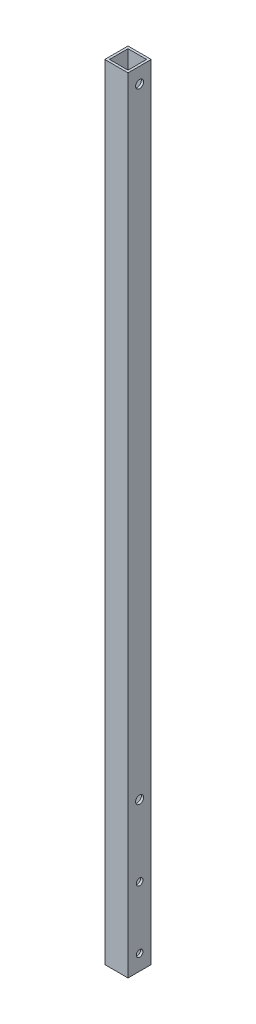
ISO-10303-21;
HEADER;
FILE_DESCRIPTION(('STEP AP214'),'2;1');
FILE_NAME('part.step','',(''),(''),'','','');
FILE_SCHEMA(('AUTOMOTIVE_DESIGN { 1 0 10303 214 1 1 1 1 }'));
ENDSEC;
DATA;
#1=APPLICATION_CONTEXT('core data for automotive mechanical design processes');
#2=APPLICATION_PROTOCOL_DEFINITION('international standard','automotive_design',2000,#1);
#3=PRODUCT_CONTEXT('',#1,'mechanical');
#4=PRODUCT('Part','Part','',(#3));
#5=PRODUCT_RELATED_PRODUCT_CATEGORY('part','',(#4));
#6=PRODUCT_DEFINITION_FORMATION('','',#4);
#7=PRODUCT_DEFINITION_CONTEXT('part definition',#1,'design');
#8=PRODUCT_DEFINITION('design','',#6,#7);
#9=PRODUCT_DEFINITION_SHAPE('','',#8);
#10=(LENGTH_UNIT() NAMED_UNIT(*) SI_UNIT(.MILLI.,.METRE.));
#11=(NAMED_UNIT(*) PLANE_ANGLE_UNIT() SI_UNIT($,.RADIAN.));
#12=(NAMED_UNIT(*) SI_UNIT($,.STERADIAN.) SOLID_ANGLE_UNIT());
#13=UNCERTAINTY_MEASURE_WITH_UNIT(LENGTH_MEASURE(1.E-05),#10,'distance_accuracy_value','');
#14=(GEOMETRIC_REPRESENTATION_CONTEXT(3) GLOBAL_UNCERTAINTY_ASSIGNED_CONTEXT((#13)) GLOBAL_UNIT_ASSIGNED_CONTEXT((#10,
#11,#12)) REPRESENTATION_CONTEXT('',''));
#15=CARTESIAN_POINT('',(0.,0.,0.));
#16=DIRECTION('',(0.,0.,1.));
#17=DIRECTION('',(1.,0.,0.));
#18=AXIS2_PLACEMENT_3D('',#15,#16,#17);
#19=CARTESIAN_POINT('',(0.,506.,0.));
#20=DIRECTION('',(0.,1.,0.));
#21=DIRECTION('',(0.,0.,1.));
#22=AXIS2_PLACEMENT_3D('',#19,#20,#21);
#23=PLANE('',#22);
#24=DIRECTION('',(0.,0.,1.));
#25=VECTOR('',#24,1.);
#26=CARTESIAN_POINT('',(0.,506.,0.));
#27=LINE('',#26,#25);
#28=CARTESIAN_POINT('',(0.,506.,-15.));
#29=VERTEX_POINT('',#28);
#30=CARTESIAN_POINT('',(0.,506.,0.));
#31=VERTEX_POINT('',#30);
#32=EDGE_CURVE('E164',#29,#31,#27,.T.);
#33=ORIENTED_EDGE('',*,*,#32,.T.);
#34=DIRECTION('',(1.,0.,0.));
#35=VECTOR('',#34,1.);
#36=CARTESIAN_POINT('',(0.,506.,0.));
#37=LINE('',#36,#35);
#38=CARTESIAN_POINT('',(15.,506.,0.));
#39=VERTEX_POINT('',#38);
#40=EDGE_CURVE('E167',#31,#39,#37,.T.);
#41=ORIENTED_EDGE('',*,*,#40,.T.);
#42=DIRECTION('',(0.,0.,-1.));
#43=VECTOR('',#42,1.);
#44=CARTESIAN_POINT('',(15.,506.,0.));
#45=LINE('',#44,#43);
#46=CARTESIAN_POINT('',(15.,506.,-15.));
#47=VERTEX_POINT('',#46);
#48=EDGE_CURVE('E170',#39,#47,#45,.T.);
#49=ORIENTED_EDGE('',*,*,#48,.T.);
#50=DIRECTION('',(-1.,0.,0.));
#51=VECTOR('',#50,1.);
#52=CARTESIAN_POINT('',(0.,506.,-15.));
#53=LINE('',#52,#51);
#54=EDGE_CURVE('E172',#47,#29,#53,.T.);
#55=ORIENTED_EDGE('',*,*,#54,.T.);
#56=EDGE_LOOP('',(#33,#41,#49,#55));
#57=FACE_BOUND('',#56,.T.);
#58=DIRECTION('',(1.,0.,0.));
#59=VECTOR('',#58,1.);
#60=CARTESIAN_POINT('',(0.,506.,-1.5));
#61=LINE('',#60,#59);
#62=CARTESIAN_POINT('',(1.5,506.,-1.5));
#63=VERTEX_POINT('',#62);
#64=CARTESIAN_POINT('',(13.5,506.,-1.5));
#65=VERTEX_POINT('',#64);
#66=EDGE_CURVE('E134',#63,#65,#61,.T.);
#67=ORIENTED_EDGE('',*,*,#66,.F.);
#68=DIRECTION('',(0.,0.,1.));
#69=VECTOR('',#68,1.);
#70=CARTESIAN_POINT('',(1.5,506.,0.));
#71=LINE('',#70,#69);
#72=CARTESIAN_POINT('',(1.5,506.,-13.5));
#73=VERTEX_POINT('',#72);
#74=EDGE_CURVE('E126',#73,#63,#71,.T.);
#75=ORIENTED_EDGE('',*,*,#74,.F.);
#76=DIRECTION('',(-1.,0.,0.));
#77=VECTOR('',#76,1.);
#78=CARTESIAN_POINT('',(0.,506.,-13.5));
#79=LINE('',#78,#77);
#80=CARTESIAN_POINT('',(13.5,506.,-13.5));
#81=VERTEX_POINT('',#80);
#82=EDGE_CURVE('E148',#81,#73,#79,.T.);
#83=ORIENTED_EDGE('',*,*,#82,.F.);
#84=DIRECTION('',(0.,0.,-1.));
#85=VECTOR('',#84,1.);
#86=CARTESIAN_POINT('',(13.5,506.,0.));
#87=LINE('',#86,#85);
#88=EDGE_CURVE('E146',#65,#81,#87,.T.);
#89=ORIENTED_EDGE('',*,*,#88,.F.);
#90=EDGE_LOOP('',(#67,#75,#83,#89));
#91=FACE_BOUND('',#90,.T.);
#92=ADVANCED_FACE('F59',(#57,#91),#23,.T.);
#93=CARTESIAN_POINT('',(0.,0.,0.));
#94=DIRECTION('',(0.,1.,0.));
#95=DIRECTION('',(0.,0.,1.));
#96=AXIS2_PLACEMENT_3D('',#93,#94,#95);
#97=PLANE('',#96);
#98=DIRECTION('',(0.,0.,1.));
#99=VECTOR('',#98,1.);
#100=CARTESIAN_POINT('',(0.,0.,0.));
#101=LINE('',#100,#99);
#102=CARTESIAN_POINT('',(0.,0.,-15.));
#103=VERTEX_POINT('',#102);
#104=CARTESIAN_POINT('',(0.,0.,0.));
#105=VERTEX_POINT('',#104);
#106=EDGE_CURVE('E142',#103,#105,#101,.T.);
#107=ORIENTED_EDGE('',*,*,#106,.F.);
#108=DIRECTION('',(-1.,0.,0.));
#109=VECTOR('',#108,1.);
#110=CARTESIAN_POINT('',(0.,0.,-15.));
#111=LINE('',#110,#109);
#112=CARTESIAN_POINT('',(15.,0.,-15.));
#113=VERTEX_POINT('',#112);
#114=EDGE_CURVE('E168',#113,#103,#111,.T.);
#115=ORIENTED_EDGE('',*,*,#114,.F.);
#116=DIRECTION('',(0.,0.,-1.));
#117=VECTOR('',#116,1.);
#118=CARTESIAN_POINT('',(15.,0.,0.));
#119=LINE('',#118,#117);
#120=CARTESIAN_POINT('',(15.,0.,0.));
#121=VERTEX_POINT('',#120);
#122=EDGE_CURVE('E179',#121,#113,#119,.T.);
#123=ORIENTED_EDGE('',*,*,#122,.F.);
#124=DIRECTION('',(1.,0.,0.));
#125=VECTOR('',#124,1.);
#126=CARTESIAN_POINT('',(0.,0.,0.));
#127=LINE('',#126,#125);
#128=EDGE_CURVE('E177',#105,#121,#127,.T.);
#129=ORIENTED_EDGE('',*,*,#128,.F.);
#130=EDGE_LOOP('',(#107,#115,#123,#129));
#131=FACE_BOUND('',#130,.T.);
#132=DIRECTION('',(0.,0.,1.));
#133=VECTOR('',#132,1.);
#134=CARTESIAN_POINT('',(1.5,0.,0.));
#135=LINE('',#134,#133);
#136=CARTESIAN_POINT('',(1.5,0.,-13.5));
#137=VERTEX_POINT('',#136);
#138=CARTESIAN_POINT('',(1.5,0.,-1.5));
#139=VERTEX_POINT('',#138);
#140=EDGE_CURVE('E84',#137,#139,#135,.T.);
#141=ORIENTED_EDGE('',*,*,#140,.T.);
#142=DIRECTION('',(1.,0.,0.));
#143=VECTOR('',#142,1.);
#144=CARTESIAN_POINT('',(0.,0.,-1.5));
#145=LINE('',#144,#143);
#146=CARTESIAN_POINT('',(13.5,0.,-1.5));
#147=VERTEX_POINT('',#146);
#148=EDGE_CURVE('E141',#139,#147,#145,.T.);
#149=ORIENTED_EDGE('',*,*,#148,.T.);
#150=DIRECTION('',(0.,0.,-1.));
#151=VECTOR('',#150,1.);
#152=CARTESIAN_POINT('',(13.5,0.,0.));
#153=LINE('',#152,#151);
#154=CARTESIAN_POINT('',(13.5,0.,-13.5));
#155=VERTEX_POINT('',#154);
#156=EDGE_CURVE('E156',#147,#155,#153,.T.);
#157=ORIENTED_EDGE('',*,*,#156,.T.);
#158=DIRECTION('',(-1.,0.,0.));
#159=VECTOR('',#158,1.);
#160=CARTESIAN_POINT('',(0.,0.,-13.5));
#161=LINE('',#160,#159);
#162=EDGE_CURVE('E135',#155,#137,#161,.T.);
#163=ORIENTED_EDGE('',*,*,#162,.T.);
#164=EDGE_LOOP('',(#141,#149,#157,#163));
#165=FACE_BOUND('',#164,.T.);
#166=ADVANCED_FACE('F231',(#131,#165),#97,.F.);
#167=CARTESIAN_POINT('',(0.,506.,0.));
#168=DIRECTION('',(1.,0.,0.));
#169=DIRECTION('',(0.,0.,-1.));
#170=AXIS2_PLACEMENT_3D('',#167,#168,#169);
#171=PLANE('',#170);
#172=CARTESIAN_POINT('',(0.,496.,-7.5));
#173=DIRECTION('',(1.,0.,0.));
#174=DIRECTION('',(0.,0.,-1.));
#175=AXIS2_PLACEMENT_3D('',#172,#173,#174);
#176=CIRCLE('',#175,2.60000000000003);
#177=CARTESIAN_POINT('',(0.,496.,-10.1));
#178=VERTEX_POINT('',#177);
#179=EDGE_CURVE('E284',#178,#178,#176,.F.);
#180=ORIENTED_EDGE('',*,*,#179,.F.);
#181=EDGE_LOOP('',(#180));
#182=FACE_BOUND('',#181,.T.);
#183=CARTESIAN_POINT('',(0.,10.,-7.50000000000011));
#184=DIRECTION('',(1.,0.,0.));
#185=DIRECTION('',(0.,0.,-1.));
#186=AXIS2_PLACEMENT_3D('',#183,#184,#185);
#187=CIRCLE('',#186,2.15);
#188=CARTESIAN_POINT('',(0.,10.,-9.65000000000012));
#189=VERTEX_POINT('',#188);
#190=EDGE_CURVE('E288',#189,#189,#187,.F.);
#191=ORIENTED_EDGE('',*,*,#190,.F.);
#192=EDGE_LOOP('',(#191));
#193=FACE_BOUND('',#192,.T.);
#194=CARTESIAN_POINT('',(0.,50.,-7.50000000000011));
#195=DIRECTION('',(1.,0.,0.));
#196=DIRECTION('',(0.,0.,-1.));
#197=AXIS2_PLACEMENT_3D('',#194,#195,#196);
#198=CIRCLE('',#197,2.15);
#199=CARTESIAN_POINT('',(0.,50.,-9.65000000000011));
#200=VERTEX_POINT('',#199);
#201=EDGE_CURVE('E292',#200,#200,#198,.F.);
#202=ORIENTED_EDGE('',*,*,#201,.F.);
#203=EDGE_LOOP('',(#202));
#204=FACE_BOUND('',#203,.T.);
#205=CARTESIAN_POINT('',(0.,96.0000000000001,-7.5));
#206=DIRECTION('',(1.,0.,0.));
#207=DIRECTION('',(0.,0.,-1.));
#208=AXIS2_PLACEMENT_3D('',#205,#206,#207);
#209=CIRCLE('',#208,2.6);
#210=CARTESIAN_POINT('',(0.,96.0000000000001,-10.1));
#211=VERTEX_POINT('',#210);
#212=EDGE_CURVE('E193',#211,#211,#209,.F.);
#213=ORIENTED_EDGE('',*,*,#212,.F.);
#214=EDGE_LOOP('',(#213));
#215=FACE_BOUND('',#214,.T.);
#216=ORIENTED_EDGE('',*,*,#106,.T.);
#217=DIRECTION('',(0.,-1.,0.));
#218=VECTOR('',#217,1.);
#219=CARTESIAN_POINT('',(0.,506.,0.));
#220=LINE('',#219,#218);
#221=EDGE_CURVE('E12',#31,#105,#220,.T.);
#222=ORIENTED_EDGE('',*,*,#221,.F.);
#223=ORIENTED_EDGE('',*,*,#32,.F.);
#224=DIRECTION('',(0.,-1.,0.));
#225=VECTOR('',#224,1.);
#226=CARTESIAN_POINT('',(0.,506.,-15.));
#227=LINE('',#226,#225);
#228=EDGE_CURVE('E174',#29,#103,#227,.T.);
#229=ORIENTED_EDGE('',*,*,#228,.T.);
#230=EDGE_LOOP('',(#216,#222,#223,#229));
#231=FACE_BOUND('',#230,.T.);
#232=ADVANCED_FACE('F61',(#182,#193,#204,#215,#231),#171,.F.);
#233=CARTESIAN_POINT('',(0.,506.,0.));
#234=DIRECTION('',(0.,0.,-1.));
#235=DIRECTION('',(-1.,0.,0.));
#236=AXIS2_PLACEMENT_3D('',#233,#234,#235);
#237=PLANE('',#236);
#238=ORIENTED_EDGE('',*,*,#128,.T.);
#239=DIRECTION('',(0.,-1.,0.));
#240=VECTOR('',#239,1.);
#241=CARTESIAN_POINT('',(15.,506.,0.));
#242=LINE('',#241,#240);
#243=EDGE_CURVE('E68',#39,#121,#242,.T.);
#244=ORIENTED_EDGE('',*,*,#243,.F.);
#245=ORIENTED_EDGE('',*,*,#40,.F.);
#246=ORIENTED_EDGE('',*,*,#221,.T.);
#247=EDGE_LOOP('',(#238,#244,#245,#246));
#248=FACE_BOUND('',#247,.T.);
#249=ADVANCED_FACE('F259',(#248),#237,.F.);
#250=CARTESIAN_POINT('',(15.,506.,0.));
#251=DIRECTION('',(-1.,0.,0.));
#252=DIRECTION('',(0.,0.,1.));
#253=AXIS2_PLACEMENT_3D('',#250,#251,#252);
#254=PLANE('',#253);
#255=CARTESIAN_POINT('',(15.,496.,-7.5));
#256=DIRECTION('',(1.,0.,0.));
#257=DIRECTION('',(0.,0.,-1.));
#258=AXIS2_PLACEMENT_3D('',#255,#256,#257);
#259=CIRCLE('',#258,2.60000000000003);
#260=CARTESIAN_POINT('',(15.,496.,-10.1));
#261=VERTEX_POINT('',#260);
#262=EDGE_CURVE('E301',#261,#261,#259,.T.);
#263=ORIENTED_EDGE('',*,*,#262,.F.);
#264=EDGE_LOOP('',(#263));
#265=FACE_BOUND('',#264,.T.);
#266=CARTESIAN_POINT('',(15.,10.,-7.50000000000011));
#267=DIRECTION('',(1.,0.,0.));
#268=DIRECTION('',(0.,0.,-1.));
#269=AXIS2_PLACEMENT_3D('',#266,#267,#268);
#270=CIRCLE('',#269,2.15);
#271=CARTESIAN_POINT('',(15.,10.,-9.65000000000012));
#272=VERTEX_POINT('',#271);
#273=EDGE_CURVE('E302',#272,#272,#270,.T.);
#274=ORIENTED_EDGE('',*,*,#273,.F.);
#275=EDGE_LOOP('',(#274));
#276=FACE_BOUND('',#275,.T.);
#277=CARTESIAN_POINT('',(15.,50.,-7.50000000000011));
#278=DIRECTION('',(1.,0.,0.));
#279=DIRECTION('',(0.,0.,-1.));
#280=AXIS2_PLACEMENT_3D('',#277,#278,#279);
#281=CIRCLE('',#280,2.15);
#282=CARTESIAN_POINT('',(15.,50.,-9.65000000000011));
#283=VERTEX_POINT('',#282);
#284=EDGE_CURVE('E309',#283,#283,#281,.T.);
#285=ORIENTED_EDGE('',*,*,#284,.F.);
#286=EDGE_LOOP('',(#285));
#287=FACE_BOUND('',#286,.T.);
#288=CARTESIAN_POINT('',(15.,96.0000000000001,-7.5));
#289=DIRECTION('',(1.,0.,0.));
#290=DIRECTION('',(0.,0.,-1.));
#291=AXIS2_PLACEMENT_3D('',#288,#289,#290);
#292=CIRCLE('',#291,2.6);
#293=CARTESIAN_POINT('',(15.,96.0000000000001,-10.1));
#294=VERTEX_POINT('',#293);
#295=EDGE_CURVE('E296',#294,#294,#292,.T.);
#296=ORIENTED_EDGE('',*,*,#295,.F.);
#297=EDGE_LOOP('',(#296));
#298=FACE_BOUND('',#297,.T.);
#299=ORIENTED_EDGE('',*,*,#122,.T.);
#300=DIRECTION('',(0.,-1.,0.));
#301=VECTOR('',#300,1.);
#302=CARTESIAN_POINT('',(15.,506.,-15.));
#303=LINE('',#302,#301);
#304=EDGE_CURVE('E184',#47,#113,#303,.T.);
#305=ORIENTED_EDGE('',*,*,#304,.F.);
#306=ORIENTED_EDGE('',*,*,#48,.F.);
#307=ORIENTED_EDGE('',*,*,#243,.T.);
#308=EDGE_LOOP('',(#299,#305,#306,#307));
#309=FACE_BOUND('',#308,.T.);
#310=ADVANCED_FACE('F256',(#265,#276,#287,#298,#309),#254,.F.);
#311=CARTESIAN_POINT('',(0.,506.,-15.));
#312=DIRECTION('',(0.,0.,1.));
#313=DIRECTION('',(1.,0.,0.));
#314=AXIS2_PLACEMENT_3D('',#311,#312,#313);
#315=PLANE('',#314);
#316=ORIENTED_EDGE('',*,*,#114,.T.);
#317=ORIENTED_EDGE('',*,*,#228,.F.);
#318=ORIENTED_EDGE('',*,*,#54,.F.);
#319=ORIENTED_EDGE('',*,*,#304,.T.);
#320=EDGE_LOOP('',(#316,#317,#318,#319));
#321=FACE_BOUND('',#320,.T.);
#322=ADVANCED_FACE('F253',(#321),#315,.F.);
#323=CARTESIAN_POINT('',(1.5,506.,0.));
#324=DIRECTION('',(1.,0.,0.));
#325=DIRECTION('',(0.,0.,-1.));
#326=AXIS2_PLACEMENT_3D('',#323,#324,#325);
#327=PLANE('',#326);
#328=CARTESIAN_POINT('',(1.5,496.,-7.5));
#329=DIRECTION('',(1.,0.,0.));
#330=DIRECTION('',(0.,0.,-1.));
#331=AXIS2_PLACEMENT_3D('',#328,#329,#330);
#332=CIRCLE('',#331,2.60000000000003);
#333=CARTESIAN_POINT('',(1.5,496.,-10.1));
#334=VERTEX_POINT('',#333);
#335=EDGE_CURVE('E154',#334,#334,#332,.T.);
#336=ORIENTED_EDGE('',*,*,#335,.F.);
#337=EDGE_LOOP('',(#336));
#338=FACE_BOUND('',#337,.T.);
#339=CARTESIAN_POINT('',(1.5,10.,-7.50000000000011));
#340=DIRECTION('',(1.,0.,0.));
#341=DIRECTION('',(0.,0.,-1.));
#342=AXIS2_PLACEMENT_3D('',#339,#340,#341);
#343=CIRCLE('',#342,2.15);
#344=CARTESIAN_POINT('',(1.5,10.,-9.65000000000012));
#345=VERTEX_POINT('',#344);
#346=EDGE_CURVE('E199',#345,#345,#343,.T.);
#347=ORIENTED_EDGE('',*,*,#346,.F.);
#348=EDGE_LOOP('',(#347));
#349=FACE_BOUND('',#348,.T.);
#350=CARTESIAN_POINT('',(1.5,50.,-7.50000000000011));
#351=DIRECTION('',(1.,0.,0.));
#352=DIRECTION('',(0.,0.,-1.));
#353=AXIS2_PLACEMENT_3D('',#350,#351,#352);
#354=CIRCLE('',#353,2.15);
#355=CARTESIAN_POINT('',(1.5,50.,-9.65000000000011));
#356=VERTEX_POINT('',#355);
#357=EDGE_CURVE('E196',#356,#356,#354,.T.);
#358=ORIENTED_EDGE('',*,*,#357,.F.);
#359=EDGE_LOOP('',(#358));
#360=FACE_BOUND('',#359,.T.);
#361=CARTESIAN_POINT('',(1.5,96.0000000000001,-7.5));
#362=DIRECTION('',(1.,0.,0.));
#363=DIRECTION('',(0.,0.,-1.));
#364=AXIS2_PLACEMENT_3D('',#361,#362,#363);
#365=CIRCLE('',#364,2.6);
#366=CARTESIAN_POINT('',(1.5,96.0000000000001,-10.1));
#367=VERTEX_POINT('',#366);
#368=EDGE_CURVE('E192',#367,#367,#365,.T.);
#369=ORIENTED_EDGE('',*,*,#368,.F.);
#370=EDGE_LOOP('',(#369));
#371=FACE_BOUND('',#370,.T.);
#372=ORIENTED_EDGE('',*,*,#140,.F.);
#373=DIRECTION('',(0.,-1.,0.));
#374=VECTOR('',#373,1.);
#375=CARTESIAN_POINT('',(1.5,506.,-13.5));
#376=LINE('',#375,#374);
#377=EDGE_CURVE('E130',#73,#137,#376,.T.);
#378=ORIENTED_EDGE('',*,*,#377,.F.);
#379=ORIENTED_EDGE('',*,*,#74,.T.);
#380=DIRECTION('',(0.,-1.,0.));
#381=VECTOR('',#380,1.);
#382=CARTESIAN_POINT('',(1.5,506.,-1.5));
#383=LINE('',#382,#381);
#384=EDGE_CURVE('E129',#63,#139,#383,.T.);
#385=ORIENTED_EDGE('',*,*,#384,.T.);
#386=EDGE_LOOP('',(#372,#378,#379,#385));
#387=FACE_BOUND('',#386,.T.);
#388=ADVANCED_FACE('F128',(#338,#349,#360,#371,#387),#327,.T.);
#389=CARTESIAN_POINT('',(0.,506.,-1.5));
#390=DIRECTION('',(0.,0.,-1.));
#391=DIRECTION('',(-1.,0.,0.));
#392=AXIS2_PLACEMENT_3D('',#389,#390,#391);
#393=PLANE('',#392);
#394=ORIENTED_EDGE('',*,*,#148,.F.);
#395=ORIENTED_EDGE('',*,*,#384,.F.);
#396=ORIENTED_EDGE('',*,*,#66,.T.);
#397=DIRECTION('',(0.,-1.,0.));
#398=VECTOR('',#397,1.);
#399=CARTESIAN_POINT('',(13.5,506.,-1.5));
#400=LINE('',#399,#398);
#401=EDGE_CURVE('E143',#65,#147,#400,.T.);
#402=ORIENTED_EDGE('',*,*,#401,.T.);
#403=EDGE_LOOP('',(#394,#395,#396,#402));
#404=FACE_BOUND('',#403,.T.);
#405=ADVANCED_FACE('F138',(#404),#393,.T.);
#406=CARTESIAN_POINT('',(13.5,506.,0.));
#407=DIRECTION('',(-1.,0.,0.));
#408=DIRECTION('',(0.,0.,1.));
#409=AXIS2_PLACEMENT_3D('',#406,#407,#408);
#410=PLANE('',#409);
#411=CARTESIAN_POINT('',(13.5,496.,-7.5));
#412=DIRECTION('',(-1.,0.,0.));
#413=DIRECTION('',(0.,0.,1.));
#414=AXIS2_PLACEMENT_3D('',#411,#412,#413);
#415=CIRCLE('',#414,2.60000000000003);
#416=CARTESIAN_POINT('',(13.5,496.,-4.89999999999997));
#417=VERTEX_POINT('',#416);
#418=EDGE_CURVE('E63',#417,#417,#415,.T.);
#419=ORIENTED_EDGE('',*,*,#418,.F.);
#420=EDGE_LOOP('',(#419));
#421=FACE_BOUND('',#420,.T.);
#422=CARTESIAN_POINT('',(13.5,10.,-7.50000000000011));
#423=DIRECTION('',(-1.,0.,0.));
#424=DIRECTION('',(0.,0.,1.));
#425=AXIS2_PLACEMENT_3D('',#422,#423,#424);
#426=CIRCLE('',#425,2.15);
#427=CARTESIAN_POINT('',(13.5,10.,-5.35000000000011));
#428=VERTEX_POINT('',#427);
#429=EDGE_CURVE('E197',#428,#428,#426,.T.);
#430=ORIENTED_EDGE('',*,*,#429,.F.);
#431=EDGE_LOOP('',(#430));
#432=FACE_BOUND('',#431,.T.);
#433=CARTESIAN_POINT('',(13.5,50.,-7.50000000000011));
#434=DIRECTION('',(-1.,0.,0.));
#435=DIRECTION('',(0.,0.,1.));
#436=AXIS2_PLACEMENT_3D('',#433,#434,#435);
#437=CIRCLE('',#436,2.15);
#438=CARTESIAN_POINT('',(13.5,50.,-5.35000000000011));
#439=VERTEX_POINT('',#438);
#440=EDGE_CURVE('E194',#439,#439,#437,.T.);
#441=ORIENTED_EDGE('',*,*,#440,.F.);
#442=EDGE_LOOP('',(#441));
#443=FACE_BOUND('',#442,.T.);
#444=CARTESIAN_POINT('',(13.5,96.0000000000001,-7.5));
#445=DIRECTION('',(-1.,0.,0.));
#446=DIRECTION('',(0.,0.,1.));
#447=AXIS2_PLACEMENT_3D('',#444,#445,#446);
#448=CIRCLE('',#447,2.6);
#449=CARTESIAN_POINT('',(13.5,96.0000000000001,-4.9));
#450=VERTEX_POINT('',#449);
#451=EDGE_CURVE('E189',#450,#450,#448,.T.);
#452=ORIENTED_EDGE('',*,*,#451,.F.);
#453=EDGE_LOOP('',(#452));
#454=FACE_BOUND('',#453,.T.);
#455=ORIENTED_EDGE('',*,*,#156,.F.);
#456=ORIENTED_EDGE('',*,*,#401,.F.);
#457=ORIENTED_EDGE('',*,*,#88,.T.);
#458=DIRECTION('',(0.,-1.,0.));
#459=VECTOR('',#458,1.);
#460=CARTESIAN_POINT('',(13.5,506.,-13.5));
#461=LINE('',#460,#459);
#462=EDGE_CURVE('E76',#81,#155,#461,.T.);
#463=ORIENTED_EDGE('',*,*,#462,.T.);
#464=EDGE_LOOP('',(#455,#456,#457,#463));
#465=FACE_BOUND('',#464,.T.);
#466=ADVANCED_FACE('F219',(#421,#432,#443,#454,#465),#410,.T.);
#467=CARTESIAN_POINT('',(0.,506.,-13.5));
#468=DIRECTION('',(0.,0.,1.));
#469=DIRECTION('',(1.,0.,0.));
#470=AXIS2_PLACEMENT_3D('',#467,#468,#469);
#471=PLANE('',#470);
#472=ORIENTED_EDGE('',*,*,#162,.F.);
#473=ORIENTED_EDGE('',*,*,#462,.F.);
#474=ORIENTED_EDGE('',*,*,#82,.T.);
#475=ORIENTED_EDGE('',*,*,#377,.T.);
#476=EDGE_LOOP('',(#472,#473,#474,#475));
#477=FACE_BOUND('',#476,.T.);
#478=ADVANCED_FACE('F222',(#477),#471,.T.);
#479=CARTESIAN_POINT('',(-7.3539105243402,96.0000000000001,-7.5));
#480=DIRECTION('',(1.,0.,0.));
#481=DIRECTION('',(0.,0.,-1.));
#482=AXIS2_PLACEMENT_3D('',#479,#480,#481);
#483=CYLINDRICAL_SURFACE('',#482,2.6);
#484=ORIENTED_EDGE('',*,*,#451,.T.);
#485=EDGE_LOOP('',(#484));
#486=FACE_BOUND('',#485,.T.);
#487=ORIENTED_EDGE('',*,*,#295,.T.);
#488=EDGE_LOOP('',(#487));
#489=FACE_BOUND('',#488,.T.);
#490=ADVANCED_FACE('F233',(#486,#489),#483,.F.);
#491=CARTESIAN_POINT('',(-7.3539105243402,50.,-7.50000000000011));
#492=DIRECTION('',(1.,0.,0.));
#493=DIRECTION('',(0.,0.,-1.));
#494=AXIS2_PLACEMENT_3D('',#491,#492,#493);
#495=CYLINDRICAL_SURFACE('',#494,2.15);
#496=ORIENTED_EDGE('',*,*,#440,.T.);
#497=EDGE_LOOP('',(#496));
#498=FACE_BOUND('',#497,.T.);
#499=ORIENTED_EDGE('',*,*,#284,.T.);
#500=EDGE_LOOP('',(#499));
#501=FACE_BOUND('',#500,.T.);
#502=ADVANCED_FACE('F238',(#498,#501),#495,.F.);
#503=CARTESIAN_POINT('',(-7.3539105243402,10.,-7.50000000000011));
#504=DIRECTION('',(1.,0.,0.));
#505=DIRECTION('',(0.,0.,-1.));
#506=AXIS2_PLACEMENT_3D('',#503,#504,#505);
#507=CYLINDRICAL_SURFACE('',#506,2.15);
#508=ORIENTED_EDGE('',*,*,#429,.T.);
#509=EDGE_LOOP('',(#508));
#510=FACE_BOUND('',#509,.T.);
#511=ORIENTED_EDGE('',*,*,#273,.T.);
#512=EDGE_LOOP('',(#511));
#513=FACE_BOUND('',#512,.T.);
#514=ADVANCED_FACE('F318',(#510,#513),#507,.F.);
#515=CARTESIAN_POINT('',(-7.3539105243402,496.,-7.5));
#516=DIRECTION('',(1.,0.,0.));
#517=DIRECTION('',(0.,0.,-1.));
#518=AXIS2_PLACEMENT_3D('',#515,#516,#517);
#519=CYLINDRICAL_SURFACE('',#518,2.60000000000003);
#520=ORIENTED_EDGE('',*,*,#418,.T.);
#521=EDGE_LOOP('',(#520));
#522=FACE_BOUND('',#521,.T.);
#523=ORIENTED_EDGE('',*,*,#262,.T.);
#524=EDGE_LOOP('',(#523));
#525=FACE_BOUND('',#524,.T.);
#526=ADVANCED_FACE('F216',(#522,#525),#519,.F.);
#527=ORIENTED_EDGE('',*,*,#368,.T.);
#528=EDGE_LOOP('',(#527));
#529=FACE_BOUND('',#528,.T.);
#530=ORIENTED_EDGE('',*,*,#212,.T.);
#531=EDGE_LOOP('',(#530));
#532=FACE_BOUND('',#531,.T.);
#533=ADVANCED_FACE('F241',(#529,#532),#483,.F.);
#534=ORIENTED_EDGE('',*,*,#357,.T.);
#535=EDGE_LOOP('',(#534));
#536=FACE_BOUND('',#535,.T.);
#537=ORIENTED_EDGE('',*,*,#201,.T.);
#538=EDGE_LOOP('',(#537));
#539=FACE_BOUND('',#538,.T.);
#540=ADVANCED_FACE('F321',(#536,#539),#495,.F.);
#541=ORIENTED_EDGE('',*,*,#346,.T.);
#542=EDGE_LOOP('',(#541));
#543=FACE_BOUND('',#542,.T.);
#544=ORIENTED_EDGE('',*,*,#190,.T.);
#545=EDGE_LOOP('',(#544));
#546=FACE_BOUND('',#545,.T.);
#547=ADVANCED_FACE('F326',(#543,#546),#507,.F.);
#548=ORIENTED_EDGE('',*,*,#335,.T.);
#549=EDGE_LOOP('',(#548));
#550=FACE_BOUND('',#549,.T.);
#551=ORIENTED_EDGE('',*,*,#179,.T.);
#552=EDGE_LOOP('',(#551));
#553=FACE_BOUND('',#552,.T.);
#554=ADVANCED_FACE('F333',(#550,#553),#519,.F.);
#555=CLOSED_SHELL('',(#92,#166,#232,#249,#310,#322,#388,#405,#466,#478,#490,#502,#514,#526,#533,
#540,#547,#554));
#556=MANIFOLD_SOLID_BREP('B2',#555);
#557=ADVANCED_BREP_SHAPE_REPRESENTATION('',(#18,#556),#14);
#558=SHAPE_DEFINITION_REPRESENTATION(#9,#557);
ENDSEC;
END-ISO-10303-21;
